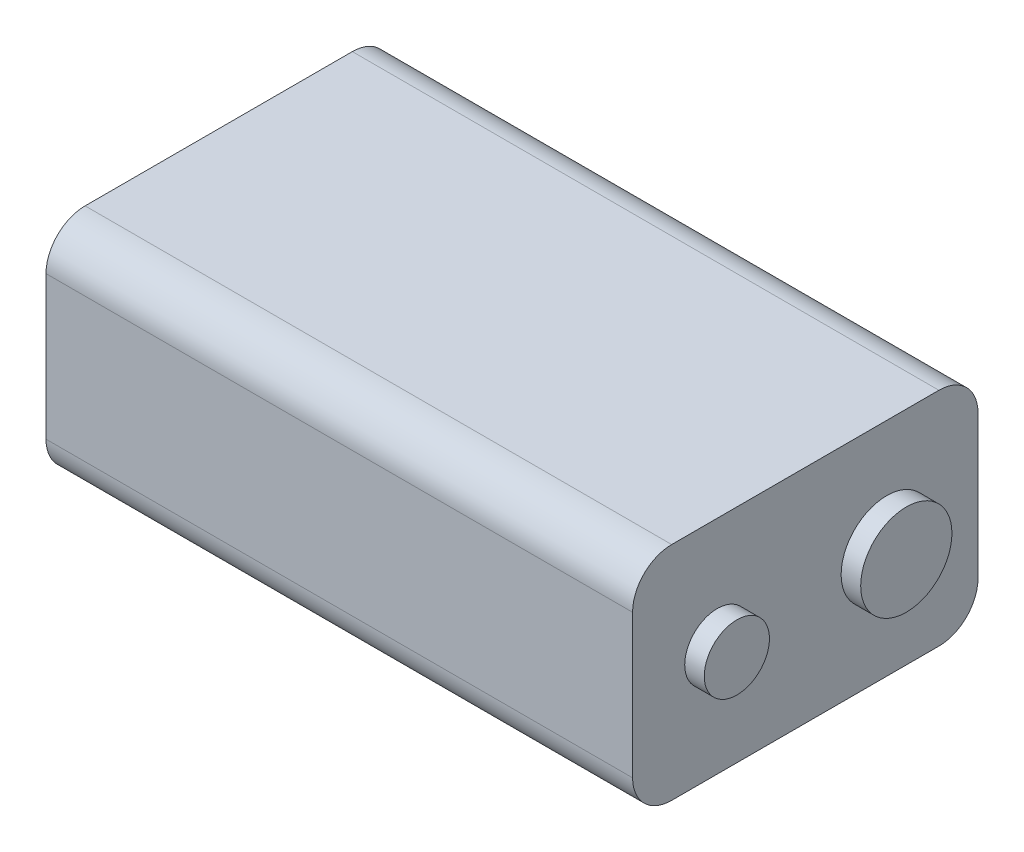
ISO-10303-21;
HEADER;
FILE_DESCRIPTION(('STEP AP214'),'2;1');
FILE_NAME('part.step','',(''),(''),'','','');
FILE_SCHEMA(('AUTOMOTIVE_DESIGN { 1 0 10303 214 1 1 1 1 }'));
ENDSEC;
DATA;
#1=APPLICATION_CONTEXT('core data for automotive mechanical design processes');
#2=APPLICATION_PROTOCOL_DEFINITION('international standard','automotive_design',2000,#1);
#3=PRODUCT_CONTEXT('',#1,'mechanical');
#4=PRODUCT('Part','Part','',(#3));
#5=PRODUCT_RELATED_PRODUCT_CATEGORY('part','',(#4));
#6=PRODUCT_DEFINITION_FORMATION('','',#4);
#7=PRODUCT_DEFINITION_CONTEXT('part definition',#1,'design');
#8=PRODUCT_DEFINITION('design','',#6,#7);
#9=PRODUCT_DEFINITION_SHAPE('','',#8);
#10=(LENGTH_UNIT() NAMED_UNIT(*) SI_UNIT(.MILLI.,.METRE.));
#11=(NAMED_UNIT(*) PLANE_ANGLE_UNIT() SI_UNIT($,.RADIAN.));
#12=(NAMED_UNIT(*) SI_UNIT($,.STERADIAN.) SOLID_ANGLE_UNIT());
#13=UNCERTAINTY_MEASURE_WITH_UNIT(LENGTH_MEASURE(1.E-05),#10,'distance_accuracy_value','');
#14=(GEOMETRIC_REPRESENTATION_CONTEXT(3) GLOBAL_UNCERTAINTY_ASSIGNED_CONTEXT((#13)) GLOBAL_UNIT_ASSIGNED_CONTEXT((#10,
#11,#12)) REPRESENTATION_CONTEXT('',''));
#15=CARTESIAN_POINT('',(0.,0.,0.));
#16=DIRECTION('',(0.,0.,1.));
#17=DIRECTION('',(1.,0.,0.));
#18=AXIS2_PLACEMENT_3D('',#15,#16,#17);
#19=CARTESIAN_POINT('',(-21.9474431166365,17.,-18.2979815786945));
#20=DIRECTION('',(1.,0.,0.));
#21=DIRECTION('',(0.,0.,-1.));
#22=AXIS2_PLACEMENT_3D('',#19,#20,#21);
#23=PLANE('',#22);
#24=DIRECTION('',(0.,0.,1.));
#25=VECTOR('',#24,1.);
#26=CARTESIAN_POINT('',(-21.9474431166365,17.,-18.2979815786945));
#27=LINE('',#26,#25);
#28=CARTESIAN_POINT('',(-21.9474431166365,17.,-15.2979815786945));
#29=VERTEX_POINT('',#28);
#30=CARTESIAN_POINT('',(-21.9474431166365,17.,5.20201842130554));
#31=VERTEX_POINT('',#30);
#32=EDGE_CURVE('E121',#29,#31,#27,.T.);
#33=ORIENTED_EDGE('',*,*,#32,.F.);
#34=CARTESIAN_POINT('',(-21.9474431166365,14.,-15.2979815786945));
#35=DIRECTION('',(1.,0.,0.));
#36=DIRECTION('',(0.,0.,-1.));
#37=AXIS2_PLACEMENT_3D('',#34,#35,#36);
#38=CIRCLE('',#37,3.);
#39=CARTESIAN_POINT('',(-21.9474431166365,14.,-18.2979815786945));
#40=VERTEX_POINT('',#39);
#41=EDGE_CURVE('E103',#29,#40,#38,.F.);
#42=ORIENTED_EDGE('',*,*,#41,.T.);
#43=DIRECTION('',(0.,-1.,0.));
#44=VECTOR('',#43,1.);
#45=CARTESIAN_POINT('',(-21.9474431166365,17.,-18.2979815786945));
#46=LINE('',#45,#44);
#47=CARTESIAN_POINT('',(-21.9474431166365,3.,-18.2979815786945));
#48=VERTEX_POINT('',#47);
#49=EDGE_CURVE('E131',#40,#48,#46,.T.);
#50=ORIENTED_EDGE('',*,*,#49,.T.);
#51=CARTESIAN_POINT('',(-21.9474431166365,3.,-15.2979815786945));
#52=DIRECTION('',(1.,0.,0.));
#53=DIRECTION('',(0.,0.,-1.));
#54=AXIS2_PLACEMENT_3D('',#51,#52,#53);
#55=CIRCLE('',#54,3.);
#56=CARTESIAN_POINT('',(-21.9474431166365,0.,-15.2979815786945));
#57=VERTEX_POINT('',#56);
#58=EDGE_CURVE('E114',#48,#57,#55,.F.);
#59=ORIENTED_EDGE('',*,*,#58,.T.);
#60=DIRECTION('',(0.,0.,1.));
#61=VECTOR('',#60,1.);
#62=CARTESIAN_POINT('',(-21.9474431166365,0.,-18.2979815786945));
#63=LINE('',#62,#61);
#64=CARTESIAN_POINT('',(-21.9474431166365,0.,5.20201842130554));
#65=VERTEX_POINT('',#64);
#66=EDGE_CURVE('E134',#57,#65,#63,.T.);
#67=ORIENTED_EDGE('',*,*,#66,.T.);
#68=CARTESIAN_POINT('',(-21.9474431166365,3.,5.20201842130554));
#69=DIRECTION('',(1.,0.,0.));
#70=DIRECTION('',(0.,0.,-1.));
#71=AXIS2_PLACEMENT_3D('',#68,#69,#70);
#72=CIRCLE('',#71,3.);
#73=CARTESIAN_POINT('',(-21.9474431166365,3.,8.20201842130554));
#74=VERTEX_POINT('',#73);
#75=EDGE_CURVE('E153',#65,#74,#72,.F.);
#76=ORIENTED_EDGE('',*,*,#75,.T.);
#77=DIRECTION('',(0.,-1.,0.));
#78=VECTOR('',#77,1.);
#79=CARTESIAN_POINT('',(-21.9474431166365,17.,8.20201842130554));
#80=LINE('',#79,#78);
#81=CARTESIAN_POINT('',(-21.9474431166365,14.,8.20201842130554));
#82=VERTEX_POINT('',#81);
#83=EDGE_CURVE('E148',#82,#74,#80,.T.);
#84=ORIENTED_EDGE('',*,*,#83,.F.);
#85=CARTESIAN_POINT('',(-21.9474431166365,14.,5.20201842130554));
#86=DIRECTION('',(1.,0.,0.));
#87=DIRECTION('',(0.,0.,-1.));
#88=AXIS2_PLACEMENT_3D('',#85,#86,#87);
#89=CIRCLE('',#88,3.);
#90=EDGE_CURVE('E124',#82,#31,#89,.F.);
#91=ORIENTED_EDGE('',*,*,#90,.T.);
#92=EDGE_LOOP('',(#33,#42,#50,#59,#67,#76,#84,#91));
#93=FACE_BOUND('',#92,.T.);
#94=ADVANCED_FACE('F36',(#93),#23,.F.);
#95=CARTESIAN_POINT('',(-21.9474431166365,17.,8.20201842130554));
#96=DIRECTION('',(0.,0.,-1.));
#97=DIRECTION('',(-1.,0.,0.));
#98=AXIS2_PLACEMENT_3D('',#95,#96,#97);
#99=PLANE('',#98);
#100=ORIENTED_EDGE('',*,*,#83,.T.);
#101=DIRECTION('',(1.,0.,0.));
#102=VECTOR('',#101,1.);
#103=CARTESIAN_POINT('',(-21.9474431166365,3.,8.20201842130554));
#104=LINE('',#103,#102);
#105=CARTESIAN_POINT('',(23.0525568833635,3.,8.20201842130554));
#106=VERTEX_POINT('',#105);
#107=EDGE_CURVE('E171',#74,#106,#104,.T.);
#108=ORIENTED_EDGE('',*,*,#107,.T.);
#109=DIRECTION('',(0.,-1.,0.));
#110=VECTOR('',#109,1.);
#111=CARTESIAN_POINT('',(23.0525568833635,17.,8.20201842130554));
#112=LINE('',#111,#110);
#113=CARTESIAN_POINT('',(23.0525568833635,14.,8.20201842130554));
#114=VERTEX_POINT('',#113);
#115=EDGE_CURVE('E146',#114,#106,#112,.T.);
#116=ORIENTED_EDGE('',*,*,#115,.F.);
#117=DIRECTION('',(1.,0.,0.));
#118=VECTOR('',#117,1.);
#119=CARTESIAN_POINT('',(-21.9474431166365,14.,8.20201842130554));
#120=LINE('',#119,#118);
#121=EDGE_CURVE('E169',#114,#82,#120,.F.);
#122=ORIENTED_EDGE('',*,*,#121,.T.);
#123=EDGE_LOOP('',(#100,#108,#116,#122));
#124=FACE_BOUND('',#123,.T.);
#125=ADVANCED_FACE('F180',(#124),#99,.F.);
#126=CARTESIAN_POINT('',(23.0525568833635,17.,-18.2979815786945));
#127=DIRECTION('',(-1.,0.,0.));
#128=DIRECTION('',(0.,0.,1.));
#129=AXIS2_PLACEMENT_3D('',#126,#127,#128);
#130=PLANE('',#129);
#131=CARTESIAN_POINT('',(23.0525568833635,8.5,1.70201842130554));
#132=DIRECTION('',(-1.,0.,0.));
#133=DIRECTION('',(0.,0.,1.));
#134=AXIS2_PLACEMENT_3D('',#131,#132,#133);
#135=CIRCLE('',#134,2.5);
#136=CARTESIAN_POINT('',(23.0525568833635,8.5,4.20201842130554));
#137=VERTEX_POINT('',#136);
#138=EDGE_CURVE('E11',#137,#137,#135,.F.);
#139=ORIENTED_EDGE('',*,*,#138,.F.);
#140=EDGE_LOOP('',(#139));
#141=FACE_BOUND('',#140,.T.);
#142=CARTESIAN_POINT('',(23.0525568833635,8.5,-11.2979815786945));
#143=DIRECTION('',(-1.,0.,0.));
#144=DIRECTION('',(0.,0.,1.));
#145=AXIS2_PLACEMENT_3D('',#142,#143,#144);
#146=CIRCLE('',#145,3.5);
#147=CARTESIAN_POINT('',(23.0525568833635,8.5,-7.79798157869446));
#148=VERTEX_POINT('',#147);
#149=EDGE_CURVE('E44',#148,#148,#146,.F.);
#150=ORIENTED_EDGE('',*,*,#149,.F.);
#151=EDGE_LOOP('',(#150));
#152=FACE_BOUND('',#151,.T.);
#153=DIRECTION('',(0.,-1.,0.));
#154=VECTOR('',#153,1.);
#155=CARTESIAN_POINT('',(23.0525568833635,17.,-18.2979815786945));
#156=LINE('',#155,#154);
#157=CARTESIAN_POINT('',(23.0525568833635,14.,-18.2979815786945));
#158=VERTEX_POINT('',#157);
#159=CARTESIAN_POINT('',(23.0525568833635,3.,-18.2979815786945));
#160=VERTEX_POINT('',#159);
#161=EDGE_CURVE('E143',#158,#160,#156,.T.);
#162=ORIENTED_EDGE('',*,*,#161,.F.);
#163=CARTESIAN_POINT('',(23.0525568833635,14.,-15.2979815786945));
#164=DIRECTION('',(-1.,0.,0.));
#165=DIRECTION('',(0.,0.,1.));
#166=AXIS2_PLACEMENT_3D('',#163,#164,#165);
#167=CIRCLE('',#166,3.);
#168=CARTESIAN_POINT('',(23.0525568833635,17.,-15.2979815786945));
#169=VERTEX_POINT('',#168);
#170=EDGE_CURVE('E163',#158,#169,#167,.F.);
#171=ORIENTED_EDGE('',*,*,#170,.T.);
#172=DIRECTION('',(0.,0.,-1.));
#173=VECTOR('',#172,1.);
#174=CARTESIAN_POINT('',(23.0525568833635,17.,-18.2979815786945));
#175=LINE('',#174,#173);
#176=CARTESIAN_POINT('',(23.0525568833635,17.,5.20201842130554));
#177=VERTEX_POINT('',#176);
#178=EDGE_CURVE('E123',#177,#169,#175,.T.);
#179=ORIENTED_EDGE('',*,*,#178,.F.);
#180=CARTESIAN_POINT('',(23.0525568833635,14.,5.20201842130554));
#181=DIRECTION('',(-1.,0.,0.));
#182=DIRECTION('',(0.,0.,1.));
#183=AXIS2_PLACEMENT_3D('',#180,#181,#182);
#184=CIRCLE('',#183,3.);
#185=EDGE_CURVE('E59',#177,#114,#184,.F.);
#186=ORIENTED_EDGE('',*,*,#185,.T.);
#187=ORIENTED_EDGE('',*,*,#115,.T.);
#188=CARTESIAN_POINT('',(23.0525568833635,3.,5.20201842130554));
#189=DIRECTION('',(-1.,0.,0.));
#190=DIRECTION('',(0.,0.,1.));
#191=AXIS2_PLACEMENT_3D('',#188,#189,#190);
#192=CIRCLE('',#191,3.);
#193=CARTESIAN_POINT('',(23.0525568833635,0.,5.20201842130554));
#194=VERTEX_POINT('',#193);
#195=EDGE_CURVE('E51',#106,#194,#192,.F.);
#196=ORIENTED_EDGE('',*,*,#195,.T.);
#197=DIRECTION('',(0.,0.,-1.));
#198=VECTOR('',#197,1.);
#199=CARTESIAN_POINT('',(23.0525568833635,0.,-18.2979815786945));
#200=LINE('',#199,#198);
#201=CARTESIAN_POINT('',(23.0525568833635,0.,-15.2979815786945));
#202=VERTEX_POINT('',#201);
#203=EDGE_CURVE('E129',#194,#202,#200,.T.);
#204=ORIENTED_EDGE('',*,*,#203,.T.);
#205=CARTESIAN_POINT('',(23.0525568833635,3.,-15.2979815786945));
#206=DIRECTION('',(-1.,0.,0.));
#207=DIRECTION('',(0.,0.,1.));
#208=AXIS2_PLACEMENT_3D('',#205,#206,#207);
#209=CIRCLE('',#208,3.);
#210=EDGE_CURVE('E161',#202,#160,#209,.F.);
#211=ORIENTED_EDGE('',*,*,#210,.T.);
#212=EDGE_LOOP('',(#162,#171,#179,#186,#187,#196,#204,#211));
#213=FACE_BOUND('',#212,.T.);
#214=ADVANCED_FACE('F177',(#141,#152,#213),#130,.F.);
#215=CARTESIAN_POINT('',(-21.9474431166365,17.,-18.2979815786945));
#216=DIRECTION('',(0.,0.,1.));
#217=DIRECTION('',(1.,0.,0.));
#218=AXIS2_PLACEMENT_3D('',#215,#216,#217);
#219=PLANE('',#218);
#220=ORIENTED_EDGE('',*,*,#49,.F.);
#221=DIRECTION('',(-1.,0.,0.));
#222=VECTOR('',#221,1.);
#223=CARTESIAN_POINT('',(23.0525568833635,14.,-18.2979815786945));
#224=LINE('',#223,#222);
#225=EDGE_CURVE('E108',#40,#158,#224,.F.);
#226=ORIENTED_EDGE('',*,*,#225,.T.);
#227=ORIENTED_EDGE('',*,*,#161,.T.);
#228=DIRECTION('',(-1.,0.,0.));
#229=VECTOR('',#228,1.);
#230=CARTESIAN_POINT('',(-21.9474431166365,3.,-18.2979815786945));
#231=LINE('',#230,#229);
#232=EDGE_CURVE('E113',#160,#48,#231,.T.);
#233=ORIENTED_EDGE('',*,*,#232,.T.);
#234=EDGE_LOOP('',(#220,#226,#227,#233));
#235=FACE_BOUND('',#234,.T.);
#236=ADVANCED_FACE('F179',(#235),#219,.F.);
#237=CARTESIAN_POINT('',(0.,17.,0.));
#238=DIRECTION('',(0.,1.,0.));
#239=DIRECTION('',(0.,0.,1.));
#240=AXIS2_PLACEMENT_3D('',#237,#238,#239);
#241=PLANE('',#240);
#242=ORIENTED_EDGE('',*,*,#178,.T.);
#243=DIRECTION('',(-1.,0.,0.));
#244=VECTOR('',#243,1.);
#245=CARTESIAN_POINT('',(-21.9474431166365,17.,-15.2979815786945));
#246=LINE('',#245,#244);
#247=EDGE_CURVE('E107',#169,#29,#246,.T.);
#248=ORIENTED_EDGE('',*,*,#247,.T.);
#249=ORIENTED_EDGE('',*,*,#32,.T.);
#250=DIRECTION('',(1.,0.,0.));
#251=VECTOR('',#250,1.);
#252=CARTESIAN_POINT('',(23.0525568833635,17.,5.20201842130554));
#253=LINE('',#252,#251);
#254=EDGE_CURVE('E125',#31,#177,#253,.T.);
#255=ORIENTED_EDGE('',*,*,#254,.T.);
#256=EDGE_LOOP('',(#242,#248,#249,#255));
#257=FACE_BOUND('',#256,.T.);
#258=ADVANCED_FACE('F119',(#257),#241,.T.);
#259=CARTESIAN_POINT('',(0.,0.,0.));
#260=DIRECTION('',(0.,1.,0.));
#261=DIRECTION('',(0.,0.,1.));
#262=AXIS2_PLACEMENT_3D('',#259,#260,#261);
#263=PLANE('',#262);
#264=ORIENTED_EDGE('',*,*,#66,.F.);
#265=DIRECTION('',(-1.,0.,0.));
#266=VECTOR('',#265,1.);
#267=CARTESIAN_POINT('',(0.,0.,-15.2979815786945));
#268=LINE('',#267,#266);
#269=EDGE_CURVE('E167',#57,#202,#268,.F.);
#270=ORIENTED_EDGE('',*,*,#269,.T.);
#271=ORIENTED_EDGE('',*,*,#203,.F.);
#272=DIRECTION('',(1.,0.,0.));
#273=VECTOR('',#272,1.);
#274=CARTESIAN_POINT('',(0.,0.,5.20201842130554));
#275=LINE('',#274,#273);
#276=EDGE_CURVE('E165',#194,#65,#275,.F.);
#277=ORIENTED_EDGE('',*,*,#276,.T.);
#278=EDGE_LOOP('',(#264,#270,#271,#277));
#279=FACE_BOUND('',#278,.T.);
#280=ADVANCED_FACE('F193',(#279),#263,.F.);
#281=CARTESIAN_POINT('',(0.,14.,-15.2979815786945));
#282=DIRECTION('',(1.,0.,0.));
#283=DIRECTION('',(0.,0.,-1.));
#284=AXIS2_PLACEMENT_3D('',#281,#282,#283);
#285=CYLINDRICAL_SURFACE('',#284,3.);
#286=ORIENTED_EDGE('',*,*,#170,.F.);
#287=ORIENTED_EDGE('',*,*,#225,.F.);
#288=ORIENTED_EDGE('',*,*,#41,.F.);
#289=ORIENTED_EDGE('',*,*,#247,.F.);
#290=EDGE_LOOP('',(#286,#287,#288,#289));
#291=FACE_BOUND('',#290,.T.);
#292=ADVANCED_FACE('F106',(#291),#285,.T.);
#293=CARTESIAN_POINT('',(-21.9474431166365,3.,-15.2979815786945));
#294=DIRECTION('',(-1.,0.,0.));
#295=DIRECTION('',(0.,0.,1.));
#296=AXIS2_PLACEMENT_3D('',#293,#294,#295);
#297=CYLINDRICAL_SURFACE('',#296,3.);
#298=ORIENTED_EDGE('',*,*,#210,.F.);
#299=ORIENTED_EDGE('',*,*,#269,.F.);
#300=ORIENTED_EDGE('',*,*,#58,.F.);
#301=ORIENTED_EDGE('',*,*,#232,.F.);
#302=EDGE_LOOP('',(#298,#299,#300,#301));
#303=FACE_BOUND('',#302,.T.);
#304=ADVANCED_FACE('F188',(#303),#297,.T.);
#305=CARTESIAN_POINT('',(-21.9474431166365,3.,5.20201842130554));
#306=DIRECTION('',(1.,0.,0.));
#307=DIRECTION('',(0.,0.,-1.));
#308=AXIS2_PLACEMENT_3D('',#305,#306,#307);
#309=CYLINDRICAL_SURFACE('',#308,3.);
#310=ORIENTED_EDGE('',*,*,#75,.F.);
#311=ORIENTED_EDGE('',*,*,#276,.F.);
#312=ORIENTED_EDGE('',*,*,#195,.F.);
#313=ORIENTED_EDGE('',*,*,#107,.F.);
#314=EDGE_LOOP('',(#310,#311,#312,#313));
#315=FACE_BOUND('',#314,.T.);
#316=ADVANCED_FACE('F195',(#315),#309,.T.);
#317=CARTESIAN_POINT('',(0.,14.,5.20201842130554));
#318=DIRECTION('',(-1.,0.,0.));
#319=DIRECTION('',(0.,0.,1.));
#320=AXIS2_PLACEMENT_3D('',#317,#318,#319);
#321=CYLINDRICAL_SURFACE('',#320,3.);
#322=ORIENTED_EDGE('',*,*,#90,.F.);
#323=ORIENTED_EDGE('',*,*,#121,.F.);
#324=ORIENTED_EDGE('',*,*,#185,.F.);
#325=ORIENTED_EDGE('',*,*,#254,.F.);
#326=EDGE_LOOP('',(#322,#323,#324,#325));
#327=FACE_BOUND('',#326,.T.);
#328=ADVANCED_FACE('F38',(#327),#321,.T.);
#329=CARTESIAN_POINT('',(24.5525568833635,8.5,-11.2979815786945));
#330=DIRECTION('',(-1.,0.,0.));
#331=DIRECTION('',(0.,0.,1.));
#332=AXIS2_PLACEMENT_3D('',#329,#330,#331);
#333=CYLINDRICAL_SURFACE('',#332,3.5);
#334=CARTESIAN_POINT('',(24.5525568833635,8.5,-11.2979815786945));
#335=DIRECTION('',(1.,0.,0.));
#336=DIRECTION('',(0.,0.,-1.));
#337=AXIS2_PLACEMENT_3D('',#334,#335,#336);
#338=CIRCLE('',#337,3.5);
#339=CARTESIAN_POINT('',(24.5525568833635,8.5,-14.7979815786945));
#340=VERTEX_POINT('',#339);
#341=EDGE_CURVE('E137',#340,#340,#338,.T.);
#342=ORIENTED_EDGE('',*,*,#341,.F.);
#343=EDGE_LOOP('',(#342));
#344=FACE_BOUND('',#343,.T.);
#345=ORIENTED_EDGE('',*,*,#149,.T.);
#346=EDGE_LOOP('',(#345));
#347=FACE_BOUND('',#346,.T.);
#348=ADVANCED_FACE('F175',(#344,#347),#333,.T.);
#349=CARTESIAN_POINT('',(24.5525568833635,8.5,-11.2979815786945));
#350=DIRECTION('',(1.,0.,0.));
#351=DIRECTION('',(0.,0.,-1.));
#352=AXIS2_PLACEMENT_3D('',#349,#350,#351);
#353=PLANE('',#352);
#354=ORIENTED_EDGE('',*,*,#341,.T.);
#355=EDGE_LOOP('',(#354));
#356=FACE_BOUND('',#355,.T.);
#357=ADVANCED_FACE('F204',(#356),#353,.T.);
#358=CARTESIAN_POINT('',(24.5525568833635,8.5,1.70201842130554));
#359=DIRECTION('',(-1.,0.,0.));
#360=DIRECTION('',(0.,0.,1.));
#361=AXIS2_PLACEMENT_3D('',#358,#359,#360);
#362=CYLINDRICAL_SURFACE('',#361,2.5);
#363=CARTESIAN_POINT('',(24.5525568833635,8.5,1.70201842130554));
#364=DIRECTION('',(1.,0.,0.));
#365=DIRECTION('',(0.,0.,-1.));
#366=AXIS2_PLACEMENT_3D('',#363,#364,#365);
#367=CIRCLE('',#366,2.5);
#368=CARTESIAN_POINT('',(24.5525568833635,8.5,-0.797981578694459));
#369=VERTEX_POINT('',#368);
#370=EDGE_CURVE('E316',#369,#369,#367,.T.);
#371=ORIENTED_EDGE('',*,*,#370,.F.);
#372=EDGE_LOOP('',(#371));
#373=FACE_BOUND('',#372,.T.);
#374=ORIENTED_EDGE('',*,*,#138,.T.);
#375=EDGE_LOOP('',(#374));
#376=FACE_BOUND('',#375,.T.);
#377=ADVANCED_FACE('F254',(#373,#376),#362,.T.);
#378=CARTESIAN_POINT('',(24.5525568833635,8.5,1.70201842130554));
#379=DIRECTION('',(1.,0.,0.));
#380=DIRECTION('',(0.,0.,-1.));
#381=AXIS2_PLACEMENT_3D('',#378,#379,#380);
#382=PLANE('',#381);
#383=ORIENTED_EDGE('',*,*,#370,.T.);
#384=EDGE_LOOP('',(#383));
#385=FACE_BOUND('',#384,.T.);
#386=ADVANCED_FACE('F264',(#385),#382,.T.);
#387=CLOSED_SHELL('',(#94,#125,#214,#236,#258,#280,#292,#304,#316,#328,#348,#357,#377,#386));
#388=MANIFOLD_SOLID_BREP('B2',#387);
#389=ADVANCED_BREP_SHAPE_REPRESENTATION('',(#18,#388),#14);
#390=SHAPE_DEFINITION_REPRESENTATION(#9,#389);
ENDSEC;
END-ISO-10303-21;
